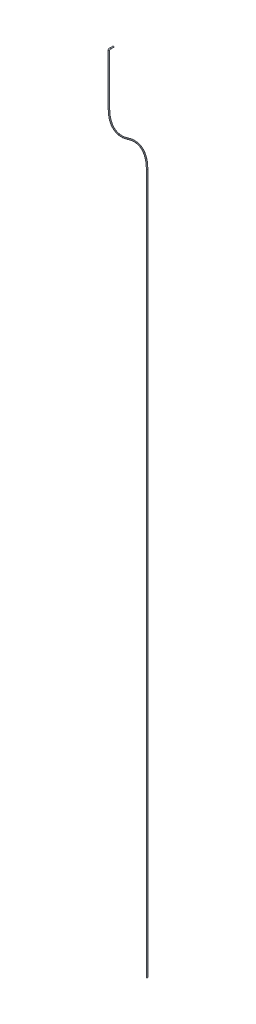
ISO-10303-21;
HEADER;
FILE_DESCRIPTION(('STEP AP214'),'2;1');
FILE_NAME('part.step','',(''),(''),'','','');
FILE_SCHEMA(('AUTOMOTIVE_DESIGN { 1 0 10303 214 1 1 1 1 }'));
ENDSEC;
DATA;
#1=APPLICATION_CONTEXT('core data for automotive mechanical design processes');
#2=APPLICATION_PROTOCOL_DEFINITION('international standard','automotive_design',2000,#1);
#3=PRODUCT_CONTEXT('',#1,'mechanical');
#4=PRODUCT('Part','Part','',(#3));
#5=PRODUCT_RELATED_PRODUCT_CATEGORY('part','',(#4));
#6=PRODUCT_DEFINITION_FORMATION('','',#4);
#7=PRODUCT_DEFINITION_CONTEXT('part definition',#1,'design');
#8=PRODUCT_DEFINITION('design','',#6,#7);
#9=PRODUCT_DEFINITION_SHAPE('','',#8);
#10=(LENGTH_UNIT() NAMED_UNIT(*) SI_UNIT(.MILLI.,.METRE.));
#11=(NAMED_UNIT(*) PLANE_ANGLE_UNIT() SI_UNIT($,.RADIAN.));
#12=(NAMED_UNIT(*) SI_UNIT($,.STERADIAN.) SOLID_ANGLE_UNIT());
#13=UNCERTAINTY_MEASURE_WITH_UNIT(LENGTH_MEASURE(1.E-05),#10,'distance_accuracy_value','');
#14=(GEOMETRIC_REPRESENTATION_CONTEXT(3) GLOBAL_UNCERTAINTY_ASSIGNED_CONTEXT((#13)) GLOBAL_UNIT_ASSIGNED_CONTEXT((#10,
#11,#12)) REPRESENTATION_CONTEXT('',''));
#15=CARTESIAN_POINT('',(0.,0.,0.));
#16=DIRECTION('',(0.,0.,1.));
#17=DIRECTION('',(1.,0.,0.));
#18=AXIS2_PLACEMENT_3D('',#15,#16,#17);
#19=CARTESIAN_POINT('',(0.,0.,15.85));
#20=DIRECTION('',(0.,0.,-1.));
#21=DIRECTION('',(0.,1.,0.));
#22=AXIS2_PLACEMENT_3D('',#19,#20,#21);
#23=PLANE('',#22);
#24=CARTESIAN_POINT('',(0.,0.,15.85));
#25=DIRECTION('',(0.,0.,-1.));
#26=DIRECTION('',(0.,1.,0.));
#27=AXIS2_PLACEMENT_3D('',#24,#25,#26);
#28=CIRCLE('',#27,0.18);
#29=CARTESIAN_POINT('',(0.,0.18,15.85));
#30=VERTEX_POINT('',#29);
#31=EDGE_CURVE('E68',#30,#30,#28,.T.);
#32=ORIENTED_EDGE('',*,*,#31,.T.);
#33=EDGE_LOOP('',(#32));
#34=FACE_BOUND('',#33,.T.);
#35=ADVANCED_FACE('F43',(#34),#23,.T.);
#36=CARTESIAN_POINT('',(0.,-277.32,4.5));
#37=DIRECTION('',(0.,1.,0.));
#38=DIRECTION('',(0.,0.,1.));
#39=AXIS2_PLACEMENT_3D('',#36,#37,#38);
#40=PLANE('',#39);
#41=CARTESIAN_POINT('',(0.,-277.32,4.5));
#42=DIRECTION('',(0.,1.,0.));
#43=DIRECTION('',(0.,0.,1.));
#44=AXIS2_PLACEMENT_3D('',#41,#42,#43);
#45=CIRCLE('',#44,0.18);
#46=CARTESIAN_POINT('',(0.,-277.32,4.68));
#47=VERTEX_POINT('',#46);
#48=EDGE_CURVE('E11',#47,#47,#45,.T.);
#49=ORIENTED_EDGE('',*,*,#48,.F.);
#50=EDGE_LOOP('',(#49));
#51=FACE_BOUND('',#50,.T.);
#52=ADVANCED_FACE('F76',(#51),#40,.F.);
#53=CARTESIAN_POINT('',(0.,0.,15.85));
#54=DIRECTION('',(0.,0.,1.));
#55=DIRECTION('',(1.,0.,0.));
#56=AXIS2_PLACEMENT_3D('',#53,#54,#55);
#57=CYLINDRICAL_SURFACE('',#56,0.18);
#58=CARTESIAN_POINT('',(0.,0.,17.05));
#59=DIRECTION('',(0.,0.,-1.));
#60=DIRECTION('',(0.,1.,0.));
#61=AXIS2_PLACEMENT_3D('',#58,#59,#60);
#62=CIRCLE('',#61,0.18);
#63=CARTESIAN_POINT('',(0.,0.18,17.05));
#64=VERTEX_POINT('',#63);
#65=EDGE_CURVE('E65',#64,#64,#62,.T.);
#66=ORIENTED_EDGE('',*,*,#65,.T.);
#67=EDGE_LOOP('',(#66));
#68=FACE_BOUND('',#67,.T.);
#69=ORIENTED_EDGE('',*,*,#31,.F.);
#70=EDGE_LOOP('',(#69));
#71=FACE_BOUND('',#70,.T.);
#72=ADVANCED_FACE('F73',(#68,#71),#57,.T.);
#73=CARTESIAN_POINT('',(0.,-0.300000000000002,17.05));
#74=DIRECTION('',(1.,0.,0.));
#75=DIRECTION('',(0.,0.,-1.));
#76=AXIS2_PLACEMENT_3D('',#73,#74,#75);
#77=TOROIDAL_SURFACE('',#76,0.300000000000002,0.18);
#78=CARTESIAN_POINT('',(0.,-0.300000000000022,17.3499999999992));
#79=DIRECTION('',(0.,1.,0.));
#80=DIRECTION('',(0.,0.,1.));
#81=AXIS2_PLACEMENT_3D('',#78,#79,#80);
#82=CIRCLE('',#81,0.18);
#83=CARTESIAN_POINT('',(0.,-0.300000000000035,17.53));
#84=VERTEX_POINT('',#83);
#85=EDGE_CURVE('E62',#84,#84,#82,.T.);
#86=CARTESIAN_POINT('',(0.,-0.300000000000002,17.05));
#87=DIRECTION('',(1.,0.,0.));
#88=DIRECTION('',(0.,0.,-1.));
#89=AXIS2_PLACEMENT_3D('',#86,#87,#88);
#90=CIRCLE('',#89,0.480000000000002);
#91=EDGE_CURVE('',#64,#84,#90,.T.);
#92=ORIENTED_EDGE('',*,*,#65,.F.);
#93=ORIENTED_EDGE('',*,*,#85,.T.);
#94=ORIENTED_EDGE('',*,*,#91,.T.);
#95=ORIENTED_EDGE('',*,*,#91,.F.);
#96=EDGE_LOOP('',(#92,#94,#93,#95));
#97=FACE_BOUND('',#96,.T.);
#98=ADVANCED_FACE('F75',(#97),#77,.T.);
#99=CARTESIAN_POINT('',(0.,-0.300000000000022,17.35));
#100=DIRECTION('',(0.,-1.,0.));
#101=DIRECTION('',(0.,0.,-1.));
#102=AXIS2_PLACEMENT_3D('',#99,#100,#101);
#103=CYLINDRICAL_SURFACE('',#102,0.18);
#104=CARTESIAN_POINT('',(0.,-17.32,17.35));
#105=DIRECTION('',(0.,1.,0.));
#106=DIRECTION('',(0.,0.,1.));
#107=AXIS2_PLACEMENT_3D('',#104,#105,#106);
#108=CIRCLE('',#107,0.18);
#109=CARTESIAN_POINT('',(0.,-17.32,17.5299999999999));
#110=VERTEX_POINT('',#109);
#111=EDGE_CURVE('E57',#110,#110,#108,.T.);
#112=ORIENTED_EDGE('',*,*,#111,.T.);
#113=EDGE_LOOP('',(#112));
#114=FACE_BOUND('',#113,.T.);
#115=ORIENTED_EDGE('',*,*,#85,.F.);
#116=EDGE_LOOP('',(#115));
#117=FACE_BOUND('',#116,.T.);
#118=ADVANCED_FACE('F83',(#114,#117),#103,.T.);
#119=CARTESIAN_POINT('',(0.,-17.32,2.93127431906614));
#120=DIRECTION('',(1.,0.,0.));
#121=DIRECTION('',(0.,0.,-1.));
#122=AXIS2_PLACEMENT_3D('',#119,#120,#121);
#123=TOROIDAL_SURFACE('',#122,14.4187256809338,0.18);
#124=CARTESIAN_POINT('',(0.,-29.32,10.925));
#125=DIRECTION('',(0.,0.554398901666054,0.832251078600366));
#126=DIRECTION('',(0.,-0.832251078600366,0.554398901666054));
#127=AXIS2_PLACEMENT_3D('',#124,#125,#126);
#128=CIRCLE('',#127,0.18);
#129=CARTESIAN_POINT('',(0.,-29.469805194148,11.0247918022998));
#130=VERTEX_POINT('',#129);
#131=EDGE_CURVE('E53',#130,#130,#128,.T.);
#132=CARTESIAN_POINT('',(0.,-17.32,2.93127431906614));
#133=DIRECTION('',(1.,0.,0.));
#134=DIRECTION('',(0.,0.,-1.));
#135=AXIS2_PLACEMENT_3D('',#132,#133,#134);
#136=CIRCLE('',#135,14.5987256809338);
#137=EDGE_CURVE('',#110,#130,#136,.T.);
#138=ORIENTED_EDGE('',*,*,#111,.F.);
#139=ORIENTED_EDGE('',*,*,#131,.T.);
#140=ORIENTED_EDGE('',*,*,#137,.T.);
#141=ORIENTED_EDGE('',*,*,#137,.F.);
#142=EDGE_LOOP('',(#138,#140,#139,#141));
#143=FACE_BOUND('',#142,.T.);
#144=ADVANCED_FACE('F94',(#143),#123,.T.);
#145=CARTESIAN_POINT('',(0.,-41.32,18.9187256809339));
#146=DIRECTION('',(-1.,0.,0.));
#147=DIRECTION('',(0.,0.,1.));
#148=AXIS2_PLACEMENT_3D('',#145,#146,#147);
#149=TOROIDAL_SURFACE('',#148,14.4187256809339,0.18);
#150=CARTESIAN_POINT('',(0.,-41.32,4.5000000000004));
#151=DIRECTION('',(0.,1.,0.));
#152=DIRECTION('',(0.,0.,1.));
#153=AXIS2_PLACEMENT_3D('',#150,#151,#152);
#154=CIRCLE('',#153,0.18);
#155=CARTESIAN_POINT('',(0.,-41.32,4.6800000000004));
#156=VERTEX_POINT('',#155);
#157=EDGE_CURVE('E49',#156,#156,#154,.T.);
#158=ORIENTED_EDGE('',*,*,#157,.T.);
#159=EDGE_LOOP('',(#158));
#160=FACE_BOUND('',#159,.T.);
#161=ORIENTED_EDGE('',*,*,#131,.F.);
#162=EDGE_LOOP('',(#161));
#163=FACE_BOUND('',#162,.T.);
#164=ADVANCED_FACE('F89',(#160,#163),#149,.T.);
#165=CARTESIAN_POINT('',(0.,-41.32,4.5));
#166=DIRECTION('',(0.,-1.,0.));
#167=DIRECTION('',(0.,0.,-1.));
#168=AXIS2_PLACEMENT_3D('',#165,#166,#167);
#169=CYLINDRICAL_SURFACE('',#168,0.18);
#170=ORIENTED_EDGE('',*,*,#48,.T.);
#171=EDGE_LOOP('',(#170));
#172=FACE_BOUND('',#171,.T.);
#173=ORIENTED_EDGE('',*,*,#157,.F.);
#174=EDGE_LOOP('',(#173));
#175=FACE_BOUND('',#174,.T.);
#176=ADVANCED_FACE('F87',(#172,#175),#169,.T.);
#177=CLOSED_SHELL('',(#35,#52,#72,#98,#118,#144,#164,#176));
#178=MANIFOLD_SOLID_BREP('B2',#177);
#179=ADVANCED_BREP_SHAPE_REPRESENTATION('',(#18,#178),#14);
#180=SHAPE_DEFINITION_REPRESENTATION(#9,#179);
ENDSEC;
END-ISO-10303-21;
